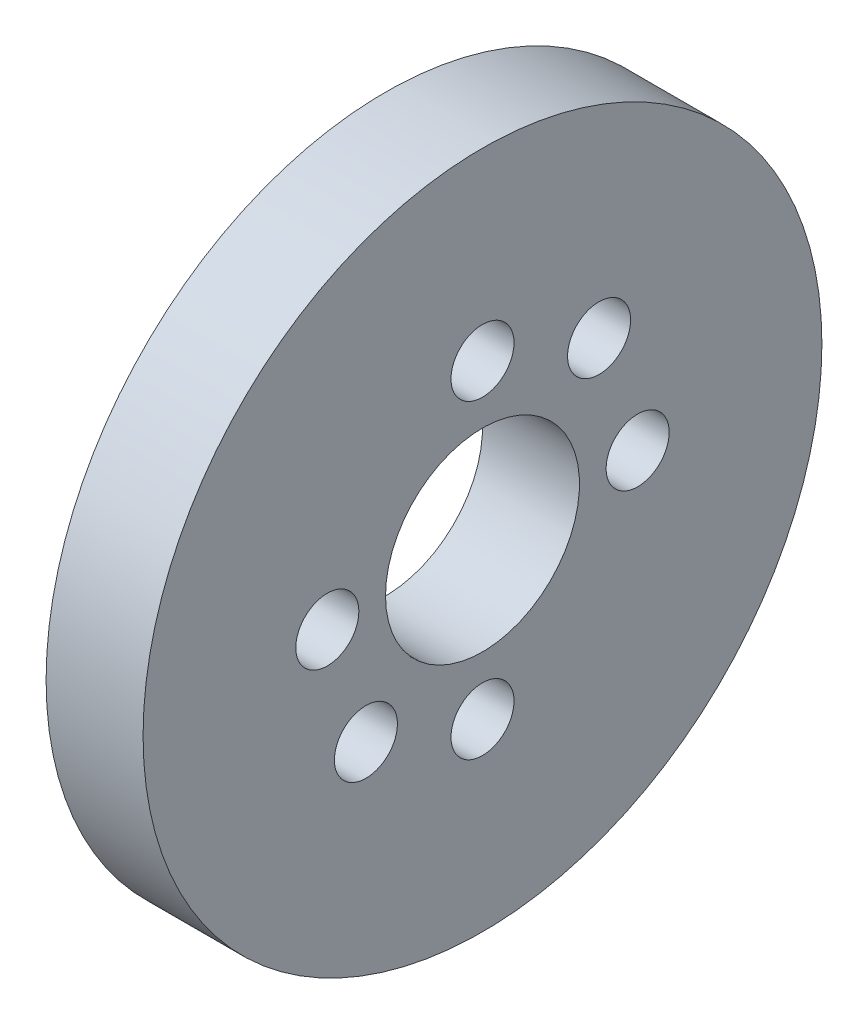
ISO-10303-21;
HEADER;
FILE_DESCRIPTION(('STEP AP214'),'2;1');
FILE_NAME('part.step','',(''),(''),'','','');
FILE_SCHEMA(('AUTOMOTIVE_DESIGN { 1 0 10303 214 1 1 1 1 }'));
ENDSEC;
DATA;
#1=APPLICATION_CONTEXT('core data for automotive mechanical design processes');
#2=APPLICATION_PROTOCOL_DEFINITION('international standard','automotive_design',2000,#1);
#3=PRODUCT_CONTEXT('',#1,'mechanical');
#4=PRODUCT('Part','Part','',(#3));
#5=PRODUCT_RELATED_PRODUCT_CATEGORY('part','',(#4));
#6=PRODUCT_DEFINITION_FORMATION('','',#4);
#7=PRODUCT_DEFINITION_CONTEXT('part definition',#1,'design');
#8=PRODUCT_DEFINITION('design','',#6,#7);
#9=PRODUCT_DEFINITION_SHAPE('','',#8);
#10=(LENGTH_UNIT() NAMED_UNIT(*) SI_UNIT(.MILLI.,.METRE.));
#11=(NAMED_UNIT(*) PLANE_ANGLE_UNIT() SI_UNIT($,.RADIAN.));
#12=(NAMED_UNIT(*) SI_UNIT($,.STERADIAN.) SOLID_ANGLE_UNIT());
#13=UNCERTAINTY_MEASURE_WITH_UNIT(LENGTH_MEASURE(1.E-05),#10,'distance_accuracy_value','');
#14=(GEOMETRIC_REPRESENTATION_CONTEXT(3) GLOBAL_UNCERTAINTY_ASSIGNED_CONTEXT((#13)) GLOBAL_UNIT_ASSIGNED_CONTEXT((#10,
#11,#12)) REPRESENTATION_CONTEXT('',''));
#15=CARTESIAN_POINT('',(0.,0.,0.));
#16=DIRECTION('',(0.,0.,1.));
#17=DIRECTION('',(1.,0.,0.));
#18=AXIS2_PLACEMENT_3D('',#15,#16,#17);
#19=CARTESIAN_POINT('',(0.,0.,0.));
#20=DIRECTION('',(-1.,0.,0.));
#21=DIRECTION('',(0.,0.,1.));
#22=AXIS2_PLACEMENT_3D('',#19,#20,#21);
#23=CYLINDRICAL_SURFACE('',#22,10.);
#24=CARTESIAN_POINT('',(10.,0.,0.));
#25=DIRECTION('',(-1.,0.,0.));
#26=DIRECTION('',(0.,0.,1.));
#27=AXIS2_PLACEMENT_3D('',#24,#25,#26);
#28=CIRCLE('',#27,10.);
#29=CARTESIAN_POINT('',(10.,0.,10.));
#30=VERTEX_POINT('',#29);
#31=EDGE_CURVE('E45',#30,#30,#28,.T.);
#32=ORIENTED_EDGE('',*,*,#31,.F.);
#33=EDGE_LOOP('',(#32));
#34=FACE_BOUND('',#33,.T.);
#35=CARTESIAN_POINT('',(0.,0.,0.));
#36=DIRECTION('',(-1.,0.,0.));
#37=DIRECTION('',(0.,0.,1.));
#38=AXIS2_PLACEMENT_3D('',#35,#36,#37);
#39=CIRCLE('',#38,10.);
#40=CARTESIAN_POINT('',(0.,0.,10.));
#41=VERTEX_POINT('',#40);
#42=EDGE_CURVE('E10',#41,#41,#39,.T.);
#43=ORIENTED_EDGE('',*,*,#42,.T.);
#44=EDGE_LOOP('',(#43));
#45=FACE_BOUND('',#44,.T.);
#46=ADVANCED_FACE('F31',(#34,#45),#23,.F.);
#47=CARTESIAN_POINT('',(0.,10.,0.));
#48=DIRECTION('',(1.,0.,0.));
#49=DIRECTION('',(0.,0.,-1.));
#50=AXIS2_PLACEMENT_3D('',#47,#48,#49);
#51=PLANE('',#50);
#52=CARTESIAN_POINT('',(0.,12.0208152801713,-12.0208152801713));
#53=DIRECTION('',(1.,0.,0.));
#54=DIRECTION('',(0.,0.,-1.));
#55=AXIS2_PLACEMENT_3D('',#52,#53,#54);
#56=CIRCLE('',#55,3.25);
#57=CARTESIAN_POINT('',(0.,12.0208152801713,-15.2708152801713));
#58=VERTEX_POINT('',#57);
#59=EDGE_CURVE('E80',#58,#58,#56,.T.);
#60=ORIENTED_EDGE('',*,*,#59,.T.);
#61=EDGE_LOOP('',(#60));
#62=FACE_BOUND('',#61,.T.);
#63=CARTESIAN_POINT('',(0.,-12.0208152801713,12.0208152801713));
#64=DIRECTION('',(1.,0.,0.));
#65=DIRECTION('',(0.,0.,-1.));
#66=AXIS2_PLACEMENT_3D('',#63,#64,#65);
#67=CIRCLE('',#66,3.25);
#68=CARTESIAN_POINT('',(0.,-12.0208152801713,8.77081528017128));
#69=VERTEX_POINT('',#68);
#70=EDGE_CURVE('E74',#69,#69,#67,.T.);
#71=ORIENTED_EDGE('',*,*,#70,.T.);
#72=EDGE_LOOP('',(#71));
#73=FACE_BOUND('',#72,.T.);
#74=CARTESIAN_POINT('',(0.,16.,0.));
#75=DIRECTION('',(1.,0.,0.));
#76=DIRECTION('',(0.,0.,-1.));
#77=AXIS2_PLACEMENT_3D('',#74,#75,#76);
#78=CIRCLE('',#77,3.25);
#79=CARTESIAN_POINT('',(0.,16.,-3.25));
#80=VERTEX_POINT('',#79);
#81=EDGE_CURVE('E68',#80,#80,#78,.T.);
#82=ORIENTED_EDGE('',*,*,#81,.T.);
#83=EDGE_LOOP('',(#82));
#84=FACE_BOUND('',#83,.T.);
#85=CARTESIAN_POINT('',(0.,0.,-16.));
#86=DIRECTION('',(1.,0.,0.));
#87=DIRECTION('',(0.,0.,-1.));
#88=AXIS2_PLACEMENT_3D('',#85,#86,#87);
#89=CIRCLE('',#88,3.25);
#90=CARTESIAN_POINT('',(0.,0.,-19.25));
#91=VERTEX_POINT('',#90);
#92=EDGE_CURVE('E62',#91,#91,#89,.T.);
#93=ORIENTED_EDGE('',*,*,#92,.T.);
#94=EDGE_LOOP('',(#93));
#95=FACE_BOUND('',#94,.T.);
#96=CARTESIAN_POINT('',(0.,-16.,0.));
#97=DIRECTION('',(1.,0.,0.));
#98=DIRECTION('',(0.,0.,-1.));
#99=AXIS2_PLACEMENT_3D('',#96,#97,#98);
#100=CIRCLE('',#99,3.25);
#101=CARTESIAN_POINT('',(0.,-16.,-3.25));
#102=VERTEX_POINT('',#101);
#103=EDGE_CURVE('E56',#102,#102,#100,.T.);
#104=ORIENTED_EDGE('',*,*,#103,.T.);
#105=EDGE_LOOP('',(#104));
#106=FACE_BOUND('',#105,.T.);
#107=CARTESIAN_POINT('',(0.,0.,16.));
#108=DIRECTION('',(1.,0.,0.));
#109=DIRECTION('',(0.,0.,-1.));
#110=AXIS2_PLACEMENT_3D('',#107,#108,#109);
#111=CIRCLE('',#110,3.25);
#112=CARTESIAN_POINT('',(0.,0.,12.75));
#113=VERTEX_POINT('',#112);
#114=EDGE_CURVE('E50',#113,#113,#111,.T.);
#115=ORIENTED_EDGE('',*,*,#114,.T.);
#116=EDGE_LOOP('',(#115));
#117=FACE_BOUND('',#116,.T.);
#118=ORIENTED_EDGE('',*,*,#42,.F.);
#119=EDGE_LOOP('',(#118));
#120=FACE_BOUND('',#119,.T.);
#121=CARTESIAN_POINT('',(0.,0.,0.));
#122=DIRECTION('',(-1.,0.,0.));
#123=DIRECTION('',(0.,0.,1.));
#124=AXIS2_PLACEMENT_3D('',#121,#122,#123);
#125=CIRCLE('',#124,35.);
#126=CARTESIAN_POINT('',(0.,0.,35.));
#127=VERTEX_POINT('',#126);
#128=EDGE_CURVE('E37',#127,#127,#125,.T.);
#129=ORIENTED_EDGE('',*,*,#128,.T.);
#130=EDGE_LOOP('',(#129));
#131=FACE_BOUND('',#130,.T.);
#132=ADVANCED_FACE('F110',(#62,#73,#84,#95,#106,#117,#120,#131),#51,.F.);
#133=CARTESIAN_POINT('',(0.,0.,0.));
#134=DIRECTION('',(-1.,0.,0.));
#135=DIRECTION('',(0.,0.,1.));
#136=AXIS2_PLACEMENT_3D('',#133,#134,#135);
#137=CYLINDRICAL_SURFACE('',#136,35.);
#138=ORIENTED_EDGE('',*,*,#128,.F.);
#139=EDGE_LOOP('',(#138));
#140=FACE_BOUND('',#139,.T.);
#141=CARTESIAN_POINT('',(10.,0.,0.));
#142=DIRECTION('',(-1.,0.,0.));
#143=DIRECTION('',(0.,0.,1.));
#144=AXIS2_PLACEMENT_3D('',#141,#142,#143);
#145=CIRCLE('',#144,35.);
#146=CARTESIAN_POINT('',(10.,0.,35.));
#147=VERTEX_POINT('',#146);
#148=EDGE_CURVE('E41',#147,#147,#145,.T.);
#149=ORIENTED_EDGE('',*,*,#148,.T.);
#150=EDGE_LOOP('',(#149));
#151=FACE_BOUND('',#150,.T.);
#152=ADVANCED_FACE('F93',(#140,#151),#137,.T.);
#153=CARTESIAN_POINT('',(10.,35.,0.));
#154=DIRECTION('',(-1.,0.,0.));
#155=DIRECTION('',(0.,0.,1.));
#156=AXIS2_PLACEMENT_3D('',#153,#154,#155);
#157=PLANE('',#156);
#158=CARTESIAN_POINT('',(10.,12.0208152801713,-12.0208152801713));
#159=DIRECTION('',(1.,0.,0.));
#160=DIRECTION('',(0.,0.,-1.));
#161=AXIS2_PLACEMENT_3D('',#158,#159,#160);
#162=CIRCLE('',#161,3.25);
#163=CARTESIAN_POINT('',(10.,12.0208152801713,-15.2708152801713));
#164=VERTEX_POINT('',#163);
#165=EDGE_CURVE('E83',#164,#164,#162,.T.);
#166=ORIENTED_EDGE('',*,*,#165,.F.);
#167=EDGE_LOOP('',(#166));
#168=FACE_BOUND('',#167,.T.);
#169=CARTESIAN_POINT('',(10.,-12.0208152801713,12.0208152801713));
#170=DIRECTION('',(1.,0.,0.));
#171=DIRECTION('',(0.,0.,-1.));
#172=AXIS2_PLACEMENT_3D('',#169,#170,#171);
#173=CIRCLE('',#172,3.25);
#174=CARTESIAN_POINT('',(10.,-12.0208152801713,8.77081528017128));
#175=VERTEX_POINT('',#174);
#176=EDGE_CURVE('E77',#175,#175,#173,.T.);
#177=ORIENTED_EDGE('',*,*,#176,.F.);
#178=EDGE_LOOP('',(#177));
#179=FACE_BOUND('',#178,.T.);
#180=CARTESIAN_POINT('',(10.,16.,0.));
#181=DIRECTION('',(1.,0.,0.));
#182=DIRECTION('',(0.,0.,-1.));
#183=AXIS2_PLACEMENT_3D('',#180,#181,#182);
#184=CIRCLE('',#183,3.25);
#185=CARTESIAN_POINT('',(10.,16.,-3.25));
#186=VERTEX_POINT('',#185);
#187=EDGE_CURVE('E71',#186,#186,#184,.T.);
#188=ORIENTED_EDGE('',*,*,#187,.F.);
#189=EDGE_LOOP('',(#188));
#190=FACE_BOUND('',#189,.T.);
#191=CARTESIAN_POINT('',(10.,0.,-16.));
#192=DIRECTION('',(1.,0.,0.));
#193=DIRECTION('',(0.,0.,-1.));
#194=AXIS2_PLACEMENT_3D('',#191,#192,#193);
#195=CIRCLE('',#194,3.25);
#196=CARTESIAN_POINT('',(10.,0.,-19.25));
#197=VERTEX_POINT('',#196);
#198=EDGE_CURVE('E65',#197,#197,#195,.T.);
#199=ORIENTED_EDGE('',*,*,#198,.F.);
#200=EDGE_LOOP('',(#199));
#201=FACE_BOUND('',#200,.T.);
#202=CARTESIAN_POINT('',(10.,-16.,0.));
#203=DIRECTION('',(1.,0.,0.));
#204=DIRECTION('',(0.,0.,-1.));
#205=AXIS2_PLACEMENT_3D('',#202,#203,#204);
#206=CIRCLE('',#205,3.25);
#207=CARTESIAN_POINT('',(10.,-16.,-3.25));
#208=VERTEX_POINT('',#207);
#209=EDGE_CURVE('E59',#208,#208,#206,.T.);
#210=ORIENTED_EDGE('',*,*,#209,.F.);
#211=EDGE_LOOP('',(#210));
#212=FACE_BOUND('',#211,.T.);
#213=CARTESIAN_POINT('',(10.,0.,16.));
#214=DIRECTION('',(1.,0.,0.));
#215=DIRECTION('',(0.,0.,-1.));
#216=AXIS2_PLACEMENT_3D('',#213,#214,#215);
#217=CIRCLE('',#216,3.25);
#218=CARTESIAN_POINT('',(10.,0.,12.75));
#219=VERTEX_POINT('',#218);
#220=EDGE_CURVE('E53',#219,#219,#217,.T.);
#221=ORIENTED_EDGE('',*,*,#220,.F.);
#222=EDGE_LOOP('',(#221));
#223=FACE_BOUND('',#222,.T.);
#224=ORIENTED_EDGE('',*,*,#148,.F.);
#225=EDGE_LOOP('',(#224));
#226=FACE_BOUND('',#225,.T.);
#227=ORIENTED_EDGE('',*,*,#31,.T.);
#228=EDGE_LOOP('',(#227));
#229=FACE_BOUND('',#228,.T.);
#230=ADVANCED_FACE('F89',(#168,#179,#190,#201,#212,#223,#226,#229),#157,.F.);
#231=CARTESIAN_POINT('',(10.,0.,16.));
#232=DIRECTION('',(1.,0.,0.));
#233=DIRECTION('',(0.,0.,-1.));
#234=AXIS2_PLACEMENT_3D('',#231,#232,#233);
#235=CYLINDRICAL_SURFACE('',#234,3.25);
#236=ORIENTED_EDGE('',*,*,#114,.F.);
#237=EDGE_LOOP('',(#236));
#238=FACE_BOUND('',#237,.T.);
#239=ORIENTED_EDGE('',*,*,#220,.T.);
#240=EDGE_LOOP('',(#239));
#241=FACE_BOUND('',#240,.T.);
#242=ADVANCED_FACE('F92',(#238,#241),#235,.F.);
#243=CARTESIAN_POINT('',(10.,-16.,0.));
#244=DIRECTION('',(1.,0.,0.));
#245=DIRECTION('',(0.,0.,-1.));
#246=AXIS2_PLACEMENT_3D('',#243,#244,#245);
#247=CYLINDRICAL_SURFACE('',#246,3.25);
#248=ORIENTED_EDGE('',*,*,#103,.F.);
#249=EDGE_LOOP('',(#248));
#250=FACE_BOUND('',#249,.T.);
#251=ORIENTED_EDGE('',*,*,#209,.T.);
#252=EDGE_LOOP('',(#251));
#253=FACE_BOUND('',#252,.T.);
#254=ADVANCED_FACE('F124',(#250,#253),#247,.F.);
#255=CARTESIAN_POINT('',(10.,0.,-16.));
#256=DIRECTION('',(1.,0.,0.));
#257=DIRECTION('',(0.,0.,-1.));
#258=AXIS2_PLACEMENT_3D('',#255,#256,#257);
#259=CYLINDRICAL_SURFACE('',#258,3.25);
#260=ORIENTED_EDGE('',*,*,#92,.F.);
#261=EDGE_LOOP('',(#260));
#262=FACE_BOUND('',#261,.T.);
#263=ORIENTED_EDGE('',*,*,#198,.T.);
#264=EDGE_LOOP('',(#263));
#265=FACE_BOUND('',#264,.T.);
#266=ADVANCED_FACE('F128',(#262,#265),#259,.F.);
#267=CARTESIAN_POINT('',(10.,16.,0.));
#268=DIRECTION('',(1.,0.,0.));
#269=DIRECTION('',(0.,0.,-1.));
#270=AXIS2_PLACEMENT_3D('',#267,#268,#269);
#271=CYLINDRICAL_SURFACE('',#270,3.25);
#272=ORIENTED_EDGE('',*,*,#81,.F.);
#273=EDGE_LOOP('',(#272));
#274=FACE_BOUND('',#273,.T.);
#275=ORIENTED_EDGE('',*,*,#187,.T.);
#276=EDGE_LOOP('',(#275));
#277=FACE_BOUND('',#276,.T.);
#278=ADVANCED_FACE('F132',(#274,#277),#271,.F.);
#279=CARTESIAN_POINT('',(10.,-12.0208152801713,12.0208152801713));
#280=DIRECTION('',(1.,0.,0.));
#281=DIRECTION('',(0.,0.,-1.));
#282=AXIS2_PLACEMENT_3D('',#279,#280,#281);
#283=CYLINDRICAL_SURFACE('',#282,3.25);
#284=ORIENTED_EDGE('',*,*,#70,.F.);
#285=EDGE_LOOP('',(#284));
#286=FACE_BOUND('',#285,.T.);
#287=ORIENTED_EDGE('',*,*,#176,.T.);
#288=EDGE_LOOP('',(#287));
#289=FACE_BOUND('',#288,.T.);
#290=ADVANCED_FACE('F136',(#286,#289),#283,.F.);
#291=CARTESIAN_POINT('',(10.,12.0208152801713,-12.0208152801713));
#292=DIRECTION('',(1.,0.,0.));
#293=DIRECTION('',(0.,0.,-1.));
#294=AXIS2_PLACEMENT_3D('',#291,#292,#293);
#295=CYLINDRICAL_SURFACE('',#294,3.25);
#296=ORIENTED_EDGE('',*,*,#59,.F.);
#297=EDGE_LOOP('',(#296));
#298=FACE_BOUND('',#297,.T.);
#299=ORIENTED_EDGE('',*,*,#165,.T.);
#300=EDGE_LOOP('',(#299));
#301=FACE_BOUND('',#300,.T.);
#302=ADVANCED_FACE('F87',(#298,#301),#295,.F.);
#303=CLOSED_SHELL('',(#46,#132,#152,#230,#242,#254,#266,#278,#290,#302));
#304=MANIFOLD_SOLID_BREP('B2',#303);
#305=ADVANCED_BREP_SHAPE_REPRESENTATION('',(#18,#304),#14);
#306=SHAPE_DEFINITION_REPRESENTATION(#9,#305);
ENDSEC;
END-ISO-10303-21;
